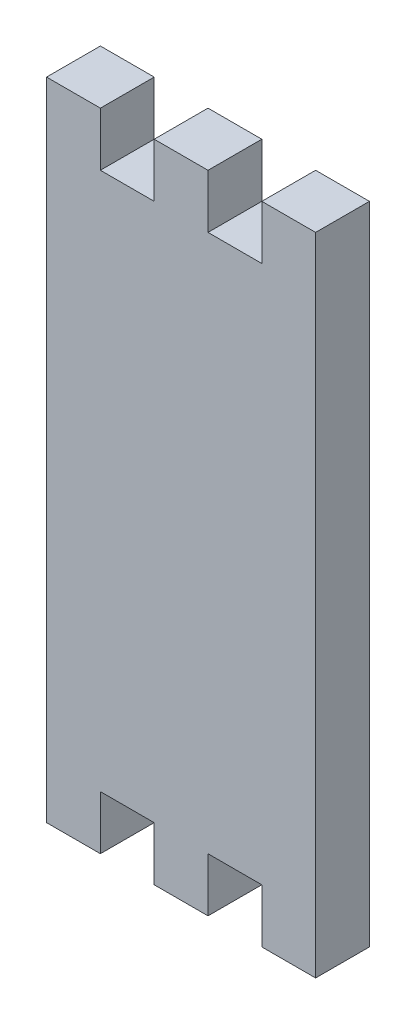
ISO-10303-21;
HEADER;
FILE_DESCRIPTION(('STEP AP214'),'2;1');
FILE_NAME('part.step','',(''),(''),'','','');
FILE_SCHEMA(('AUTOMOTIVE_DESIGN { 1 0 10303 214 1 1 1 1 }'));
ENDSEC;
DATA;
#1=APPLICATION_CONTEXT('core data for automotive mechanical design processes');
#2=APPLICATION_PROTOCOL_DEFINITION('international standard','automotive_design',2000,#1);
#3=PRODUCT_CONTEXT('',#1,'mechanical');
#4=PRODUCT('Part','Part','',(#3));
#5=PRODUCT_RELATED_PRODUCT_CATEGORY('part','',(#4));
#6=PRODUCT_DEFINITION_FORMATION('','',#4);
#7=PRODUCT_DEFINITION_CONTEXT('part definition',#1,'design');
#8=PRODUCT_DEFINITION('design','',#6,#7);
#9=PRODUCT_DEFINITION_SHAPE('','',#8);
#10=(LENGTH_UNIT() NAMED_UNIT(*) SI_UNIT(.MILLI.,.METRE.));
#11=(NAMED_UNIT(*) PLANE_ANGLE_UNIT() SI_UNIT($,.RADIAN.));
#12=(NAMED_UNIT(*) SI_UNIT($,.STERADIAN.) SOLID_ANGLE_UNIT());
#13=UNCERTAINTY_MEASURE_WITH_UNIT(LENGTH_MEASURE(1.E-05),#10,'distance_accuracy_value','');
#14=(GEOMETRIC_REPRESENTATION_CONTEXT(3) GLOBAL_UNCERTAINTY_ASSIGNED_CONTEXT((#13)) GLOBAL_UNIT_ASSIGNED_CONTEXT((#10,
#11,#12)) REPRESENTATION_CONTEXT('',''));
#15=CARTESIAN_POINT('',(0.,0.,0.));
#16=DIRECTION('',(0.,0.,1.));
#17=DIRECTION('',(1.,0.,0.));
#18=AXIS2_PLACEMENT_3D('',#15,#16,#17);
#19=CARTESIAN_POINT('',(2.41645885286782,18.0897755610973,3.));
#20=DIRECTION('',(1.,0.,0.));
#21=DIRECTION('',(0.,0.,-1.));
#22=AXIS2_PLACEMENT_3D('',#19,#20,#21);
#23=PLANE('',#22);
#24=DIRECTION('',(0.,-1.,0.));
#25=VECTOR('',#24,1.);
#26=CARTESIAN_POINT('',(2.41645885286782,18.0897755610973,0.));
#27=LINE('',#26,#25);
#28=CARTESIAN_POINT('',(2.41645885286782,18.0897755610973,0.));
#29=VERTEX_POINT('',#28);
#30=CARTESIAN_POINT('',(2.41645885286782,-17.9102244389027,0.));
#31=VERTEX_POINT('',#30);
#32=EDGE_CURVE('E212',#29,#31,#27,.T.);
#33=ORIENTED_EDGE('',*,*,#32,.T.);
#34=DIRECTION('',(0.,0.,-1.));
#35=VECTOR('',#34,1.);
#36=CARTESIAN_POINT('',(2.41645885286782,-17.9102244389027,3.));
#37=LINE('',#36,#35);
#38=CARTESIAN_POINT('',(2.41645885286782,-17.9102244389027,3.));
#39=VERTEX_POINT('',#38);
#40=EDGE_CURVE('E11',#39,#31,#37,.T.);
#41=ORIENTED_EDGE('',*,*,#40,.F.);
#42=DIRECTION('',(0.,-1.,0.));
#43=VECTOR('',#42,1.);
#44=CARTESIAN_POINT('',(2.41645885286782,18.0897755610973,3.));
#45=LINE('',#44,#43);
#46=CARTESIAN_POINT('',(2.41645885286782,18.0897755610973,3.));
#47=VERTEX_POINT('',#46);
#48=EDGE_CURVE('E270',#47,#39,#45,.T.);
#49=ORIENTED_EDGE('',*,*,#48,.F.);
#50=DIRECTION('',(0.,0.,-1.));
#51=VECTOR('',#50,1.);
#52=CARTESIAN_POINT('',(2.41645885286782,18.0897755610973,3.));
#53=LINE('',#52,#51);
#54=EDGE_CURVE('E208',#47,#29,#53,.T.);
#55=ORIENTED_EDGE('',*,*,#54,.T.);
#56=EDGE_LOOP('',(#33,#41,#49,#55));
#57=FACE_BOUND('',#56,.T.);
#58=ADVANCED_FACE('F39',(#57),#23,.F.);
#59=CARTESIAN_POINT('',(2.41645885286782,-17.9102244389027,3.));
#60=DIRECTION('',(0.,1.,0.));
#61=DIRECTION('',(0.,0.,1.));
#62=AXIS2_PLACEMENT_3D('',#59,#60,#61);
#63=PLANE('',#62);
#64=DIRECTION('',(1.,0.,0.));
#65=VECTOR('',#64,1.);
#66=CARTESIAN_POINT('',(2.41645885286782,-17.9102244389027,0.));
#67=LINE('',#66,#65);
#68=CARTESIAN_POINT('',(5.41645885286783,-17.9102244389027,0.));
#69=VERTEX_POINT('',#68);
#70=EDGE_CURVE('E216',#31,#69,#67,.T.);
#71=ORIENTED_EDGE('',*,*,#70,.T.);
#72=DIRECTION('',(0.,0.,-1.));
#73=VECTOR('',#72,1.);
#74=CARTESIAN_POINT('',(5.41645885286783,-17.9102244389027,3.));
#75=LINE('',#74,#73);
#76=CARTESIAN_POINT('',(5.41645885286783,-17.9102244389027,3.));
#77=VERTEX_POINT('',#76);
#78=EDGE_CURVE('E48',#77,#69,#75,.T.);
#79=ORIENTED_EDGE('',*,*,#78,.F.);
#80=DIRECTION('',(1.,0.,0.));
#81=VECTOR('',#80,1.);
#82=CARTESIAN_POINT('',(2.41645885286782,-17.9102244389027,3.));
#83=LINE('',#82,#81);
#84=EDGE_CURVE('E135',#39,#77,#83,.T.);
#85=ORIENTED_EDGE('',*,*,#84,.F.);
#86=ORIENTED_EDGE('',*,*,#40,.T.);
#87=EDGE_LOOP('',(#71,#79,#85,#86));
#88=FACE_BOUND('',#87,.T.);
#89=ADVANCED_FACE('F420',(#88),#63,.F.);
#90=CARTESIAN_POINT('',(5.41645885286783,-14.9102244389028,3.));
#91=DIRECTION('',(-1.,0.,0.));
#92=DIRECTION('',(0.,0.,1.));
#93=AXIS2_PLACEMENT_3D('',#90,#91,#92);
#94=PLANE('',#93);
#95=DIRECTION('',(0.,1.,0.));
#96=VECTOR('',#95,1.);
#97=CARTESIAN_POINT('',(5.41645885286783,-14.9102244389028,0.));
#98=LINE('',#97,#96);
#99=CARTESIAN_POINT('',(5.41645885286783,-14.9102244389028,0.));
#100=VERTEX_POINT('',#99);
#101=EDGE_CURVE('E219',#69,#100,#98,.T.);
#102=ORIENTED_EDGE('',*,*,#101,.T.);
#103=DIRECTION('',(0.,0.,-1.));
#104=VECTOR('',#103,1.);
#105=CARTESIAN_POINT('',(5.41645885286783,-14.9102244389028,3.));
#106=LINE('',#105,#104);
#107=CARTESIAN_POINT('',(5.41645885286783,-14.9102244389028,3.));
#108=VERTEX_POINT('',#107);
#109=EDGE_CURVE('E329',#108,#100,#106,.T.);
#110=ORIENTED_EDGE('',*,*,#109,.F.);
#111=DIRECTION('',(0.,1.,0.));
#112=VECTOR('',#111,1.);
#113=CARTESIAN_POINT('',(5.41645885286783,-14.9102244389028,3.));
#114=LINE('',#113,#112);
#115=EDGE_CURVE('E339',#77,#108,#114,.T.);
#116=ORIENTED_EDGE('',*,*,#115,.F.);
#117=ORIENTED_EDGE('',*,*,#78,.T.);
#118=EDGE_LOOP('',(#102,#110,#116,#117));
#119=FACE_BOUND('',#118,.T.);
#120=ADVANCED_FACE('F337',(#119),#94,.F.);
#121=CARTESIAN_POINT('',(5.41645885286783,-14.9102244389028,3.));
#122=DIRECTION('',(0.,1.,0.));
#123=DIRECTION('',(0.,0.,1.));
#124=AXIS2_PLACEMENT_3D('',#121,#122,#123);
#125=PLANE('',#124);
#126=DIRECTION('',(1.,0.,0.));
#127=VECTOR('',#126,1.);
#128=CARTESIAN_POINT('',(5.41645885286783,-14.9102244389028,0.));
#129=LINE('',#128,#127);
#130=CARTESIAN_POINT('',(8.41645885286783,-14.9102244389028,0.));
#131=VERTEX_POINT('',#130);
#132=EDGE_CURVE('E222',#100,#131,#129,.T.);
#133=ORIENTED_EDGE('',*,*,#132,.T.);
#134=DIRECTION('',(0.,0.,-1.));
#135=VECTOR('',#134,1.);
#136=CARTESIAN_POINT('',(8.41645885286783,-14.9102244389028,3.));
#137=LINE('',#136,#135);
#138=CARTESIAN_POINT('',(8.41645885286783,-14.9102244389028,3.));
#139=VERTEX_POINT('',#138);
#140=EDGE_CURVE('E325',#139,#131,#137,.T.);
#141=ORIENTED_EDGE('',*,*,#140,.F.);
#142=DIRECTION('',(1.,0.,0.));
#143=VECTOR('',#142,1.);
#144=CARTESIAN_POINT('',(5.41645885286783,-14.9102244389028,3.));
#145=LINE('',#144,#143);
#146=EDGE_CURVE('E358',#108,#139,#145,.T.);
#147=ORIENTED_EDGE('',*,*,#146,.F.);
#148=ORIENTED_EDGE('',*,*,#109,.T.);
#149=EDGE_LOOP('',(#133,#141,#147,#148));
#150=FACE_BOUND('',#149,.T.);
#151=ADVANCED_FACE('F348',(#150),#125,.F.);
#152=CARTESIAN_POINT('',(8.41645885286783,-14.9102244389028,3.));
#153=DIRECTION('',(1.,0.,0.));
#154=DIRECTION('',(0.,0.,-1.));
#155=AXIS2_PLACEMENT_3D('',#152,#153,#154);
#156=PLANE('',#155);
#157=DIRECTION('',(0.,-1.,0.));
#158=VECTOR('',#157,1.);
#159=CARTESIAN_POINT('',(8.41645885286783,-14.9102244389028,0.));
#160=LINE('',#159,#158);
#161=CARTESIAN_POINT('',(8.41645885286783,-17.9102244389027,0.));
#162=VERTEX_POINT('',#161);
#163=EDGE_CURVE('E225',#131,#162,#160,.T.);
#164=ORIENTED_EDGE('',*,*,#163,.T.);
#165=DIRECTION('',(0.,0.,-1.));
#166=VECTOR('',#165,1.);
#167=CARTESIAN_POINT('',(8.41645885286783,-17.9102244389027,3.));
#168=LINE('',#167,#166);
#169=CARTESIAN_POINT('',(8.41645885286783,-17.9102244389027,3.));
#170=VERTEX_POINT('',#169);
#171=EDGE_CURVE('E321',#170,#162,#168,.T.);
#172=ORIENTED_EDGE('',*,*,#171,.F.);
#173=DIRECTION('',(0.,-1.,0.));
#174=VECTOR('',#173,1.);
#175=CARTESIAN_POINT('',(8.41645885286783,-14.9102244389028,3.));
#176=LINE('',#175,#174);
#177=EDGE_CURVE('E354',#139,#170,#176,.T.);
#178=ORIENTED_EDGE('',*,*,#177,.F.);
#179=ORIENTED_EDGE('',*,*,#140,.T.);
#180=EDGE_LOOP('',(#164,#172,#178,#179));
#181=FACE_BOUND('',#180,.T.);
#182=ADVANCED_FACE('F352',(#181),#156,.F.);
#183=CARTESIAN_POINT('',(8.41645885286783,-17.9102244389027,3.));
#184=DIRECTION('',(0.,1.,0.));
#185=DIRECTION('',(0.,0.,1.));
#186=AXIS2_PLACEMENT_3D('',#183,#184,#185);
#187=PLANE('',#186);
#188=DIRECTION('',(1.,0.,0.));
#189=VECTOR('',#188,1.);
#190=CARTESIAN_POINT('',(8.41645885286783,-17.9102244389027,0.));
#191=LINE('',#190,#189);
#192=CARTESIAN_POINT('',(11.4164588528678,-17.9102244389027,0.));
#193=VERTEX_POINT('',#192);
#194=EDGE_CURVE('E228',#162,#193,#191,.T.);
#195=ORIENTED_EDGE('',*,*,#194,.T.);
#196=DIRECTION('',(0.,0.,-1.));
#197=VECTOR('',#196,1.);
#198=CARTESIAN_POINT('',(11.4164588528678,-17.9102244389027,3.));
#199=LINE('',#198,#197);
#200=CARTESIAN_POINT('',(11.4164588528678,-17.9102244389027,3.));
#201=VERTEX_POINT('',#200);
#202=EDGE_CURVE('E317',#201,#193,#199,.T.);
#203=ORIENTED_EDGE('',*,*,#202,.F.);
#204=DIRECTION('',(1.,0.,0.));
#205=VECTOR('',#204,1.);
#206=CARTESIAN_POINT('',(8.41645885286783,-17.9102244389027,3.));
#207=LINE('',#206,#205);
#208=EDGE_CURVE('E357',#170,#201,#207,.T.);
#209=ORIENTED_EDGE('',*,*,#208,.F.);
#210=ORIENTED_EDGE('',*,*,#171,.T.);
#211=EDGE_LOOP('',(#195,#203,#209,#210));
#212=FACE_BOUND('',#211,.T.);
#213=ADVANCED_FACE('F433',(#212),#187,.F.);
#214=CARTESIAN_POINT('',(11.4164588528678,-14.9102244389028,3.));
#215=DIRECTION('',(-1.,0.,0.));
#216=DIRECTION('',(0.,0.,1.));
#217=AXIS2_PLACEMENT_3D('',#214,#215,#216);
#218=PLANE('',#217);
#219=DIRECTION('',(0.,1.,0.));
#220=VECTOR('',#219,1.);
#221=CARTESIAN_POINT('',(11.4164588528678,-14.9102244389028,0.));
#222=LINE('',#221,#220);
#223=CARTESIAN_POINT('',(11.4164588528678,-14.9102244389028,0.));
#224=VERTEX_POINT('',#223);
#225=EDGE_CURVE('E231',#193,#224,#222,.T.);
#226=ORIENTED_EDGE('',*,*,#225,.T.);
#227=DIRECTION('',(0.,0.,-1.));
#228=VECTOR('',#227,1.);
#229=CARTESIAN_POINT('',(11.4164588528678,-14.9102244389028,3.));
#230=LINE('',#229,#228);
#231=CARTESIAN_POINT('',(11.4164588528678,-14.9102244389028,3.));
#232=VERTEX_POINT('',#231);
#233=EDGE_CURVE('E313',#232,#224,#230,.T.);
#234=ORIENTED_EDGE('',*,*,#233,.F.);
#235=DIRECTION('',(0.,1.,0.));
#236=VECTOR('',#235,1.);
#237=CARTESIAN_POINT('',(11.4164588528678,-14.9102244389028,3.));
#238=LINE('',#237,#236);
#239=EDGE_CURVE('E362',#201,#232,#238,.T.);
#240=ORIENTED_EDGE('',*,*,#239,.F.);
#241=ORIENTED_EDGE('',*,*,#202,.T.);
#242=EDGE_LOOP('',(#226,#234,#240,#241));
#243=FACE_BOUND('',#242,.T.);
#244=ADVANCED_FACE('F436',(#243),#218,.F.);
#245=CARTESIAN_POINT('',(14.4164588528678,-14.9102244389028,3.));
#246=DIRECTION('',(0.,1.,0.));
#247=DIRECTION('',(0.,0.,1.));
#248=AXIS2_PLACEMENT_3D('',#245,#246,#247);
#249=PLANE('',#248);
#250=DIRECTION('',(1.,0.,0.));
#251=VECTOR('',#250,1.);
#252=CARTESIAN_POINT('',(14.4164588528678,-14.9102244389028,0.));
#253=LINE('',#252,#251);
#254=CARTESIAN_POINT('',(14.4164588528678,-14.9102244389028,0.));
#255=VERTEX_POINT('',#254);
#256=EDGE_CURVE('E234',#224,#255,#253,.T.);
#257=ORIENTED_EDGE('',*,*,#256,.T.);
#258=DIRECTION('',(0.,0.,-1.));
#259=VECTOR('',#258,1.);
#260=CARTESIAN_POINT('',(14.4164588528678,-14.9102244389028,3.));
#261=LINE('',#260,#259);
#262=CARTESIAN_POINT('',(14.4164588528678,-14.9102244389028,3.));
#263=VERTEX_POINT('',#262);
#264=EDGE_CURVE('E309',#263,#255,#261,.T.);
#265=ORIENTED_EDGE('',*,*,#264,.F.);
#266=DIRECTION('',(1.,0.,0.));
#267=VECTOR('',#266,1.);
#268=CARTESIAN_POINT('',(14.4164588528678,-14.9102244389028,3.));
#269=LINE('',#268,#267);
#270=EDGE_CURVE('E369',#232,#263,#269,.T.);
#271=ORIENTED_EDGE('',*,*,#270,.F.);
#272=ORIENTED_EDGE('',*,*,#233,.T.);
#273=EDGE_LOOP('',(#257,#265,#271,#272));
#274=FACE_BOUND('',#273,.T.);
#275=ADVANCED_FACE('F440',(#274),#249,.F.);
#276=CARTESIAN_POINT('',(14.4164588528678,-14.9102244389028,3.));
#277=DIRECTION('',(1.,0.,0.));
#278=DIRECTION('',(0.,0.,-1.));
#279=AXIS2_PLACEMENT_3D('',#276,#277,#278);
#280=PLANE('',#279);
#281=DIRECTION('',(0.,-1.,0.));
#282=VECTOR('',#281,1.);
#283=CARTESIAN_POINT('',(14.4164588528678,-14.9102244389028,0.));
#284=LINE('',#283,#282);
#285=CARTESIAN_POINT('',(14.4164588528678,-17.9102244389027,0.));
#286=VERTEX_POINT('',#285);
#287=EDGE_CURVE('E237',#255,#286,#284,.T.);
#288=ORIENTED_EDGE('',*,*,#287,.T.);
#289=DIRECTION('',(0.,0.,-1.));
#290=VECTOR('',#289,1.);
#291=CARTESIAN_POINT('',(14.4164588528678,-17.9102244389027,3.));
#292=LINE('',#291,#290);
#293=CARTESIAN_POINT('',(14.4164588528678,-17.9102244389027,3.));
#294=VERTEX_POINT('',#293);
#295=EDGE_CURVE('E305',#294,#286,#292,.T.);
#296=ORIENTED_EDGE('',*,*,#295,.F.);
#297=DIRECTION('',(0.,-1.,0.));
#298=VECTOR('',#297,1.);
#299=CARTESIAN_POINT('',(14.4164588528678,-14.9102244389028,3.));
#300=LINE('',#299,#298);
#301=EDGE_CURVE('E372',#263,#294,#300,.T.);
#302=ORIENTED_EDGE('',*,*,#301,.F.);
#303=ORIENTED_EDGE('',*,*,#264,.T.);
#304=EDGE_LOOP('',(#288,#296,#302,#303));
#305=FACE_BOUND('',#304,.T.);
#306=ADVANCED_FACE('F444',(#305),#280,.F.);
#307=CARTESIAN_POINT('',(14.4164588528678,-17.9102244389027,3.));
#308=DIRECTION('',(0.,1.,0.));
#309=DIRECTION('',(-1.,0.,0.));
#310=AXIS2_PLACEMENT_3D('',#307,#308,#309);
#311=PLANE('',#310);
#312=DIRECTION('',(1.,0.,0.));
#313=VECTOR('',#312,1.);
#314=CARTESIAN_POINT('',(14.4164588528678,-17.9102244389027,0.));
#315=LINE('',#314,#313);
#316=CARTESIAN_POINT('',(17.4164588528678,-17.9102244389027,0.));
#317=VERTEX_POINT('',#316);
#318=EDGE_CURVE('E240',#286,#317,#315,.T.);
#319=ORIENTED_EDGE('',*,*,#318,.T.);
#320=DIRECTION('',(0.,0.,-1.));
#321=VECTOR('',#320,1.);
#322=CARTESIAN_POINT('',(17.4164588528678,-17.9102244389027,3.));
#323=LINE('',#322,#321);
#324=CARTESIAN_POINT('',(17.4164588528678,-17.9102244389027,3.));
#325=VERTEX_POINT('',#324);
#326=EDGE_CURVE('E301',#325,#317,#323,.T.);
#327=ORIENTED_EDGE('',*,*,#326,.F.);
#328=DIRECTION('',(1.,0.,0.));
#329=VECTOR('',#328,1.);
#330=CARTESIAN_POINT('',(14.4164588528678,-17.9102244389027,3.));
#331=LINE('',#330,#329);
#332=EDGE_CURVE('E375',#294,#325,#331,.T.);
#333=ORIENTED_EDGE('',*,*,#332,.F.);
#334=ORIENTED_EDGE('',*,*,#295,.T.);
#335=EDGE_LOOP('',(#319,#327,#333,#334));
#336=FACE_BOUND('',#335,.T.);
#337=ADVANCED_FACE('F448',(#336),#311,.F.);
#338=CARTESIAN_POINT('',(17.4164588528678,18.0897755610973,3.));
#339=DIRECTION('',(-1.,0.,0.));
#340=DIRECTION('',(0.,0.,1.));
#341=AXIS2_PLACEMENT_3D('',#338,#339,#340);
#342=PLANE('',#341);
#343=DIRECTION('',(0.,1.,0.));
#344=VECTOR('',#343,1.);
#345=CARTESIAN_POINT('',(17.4164588528678,18.0897755610973,0.));
#346=LINE('',#345,#344);
#347=CARTESIAN_POINT('',(17.4164588528678,18.0897755610973,0.));
#348=VERTEX_POINT('',#347);
#349=EDGE_CURVE('E243',#317,#348,#346,.T.);
#350=ORIENTED_EDGE('',*,*,#349,.T.);
#351=DIRECTION('',(0.,0.,-1.));
#352=VECTOR('',#351,1.);
#353=CARTESIAN_POINT('',(17.4164588528678,18.0897755610973,3.));
#354=LINE('',#353,#352);
#355=CARTESIAN_POINT('',(17.4164588528678,18.0897755610973,3.));
#356=VERTEX_POINT('',#355);
#357=EDGE_CURVE('E297',#356,#348,#354,.T.);
#358=ORIENTED_EDGE('',*,*,#357,.F.);
#359=DIRECTION('',(0.,1.,0.));
#360=VECTOR('',#359,1.);
#361=CARTESIAN_POINT('',(17.4164588528678,18.0897755610973,3.));
#362=LINE('',#361,#360);
#363=EDGE_CURVE('E378',#325,#356,#362,.T.);
#364=ORIENTED_EDGE('',*,*,#363,.F.);
#365=ORIENTED_EDGE('',*,*,#326,.T.);
#366=EDGE_LOOP('',(#350,#358,#364,#365));
#367=FACE_BOUND('',#366,.T.);
#368=ADVANCED_FACE('F452',(#367),#342,.F.);
#369=CARTESIAN_POINT('',(14.4164588528678,18.0897755610973,3.));
#370=DIRECTION('',(0.,-1.,0.));
#371=DIRECTION('',(0.,0.,-1.));
#372=AXIS2_PLACEMENT_3D('',#369,#370,#371);
#373=PLANE('',#372);
#374=DIRECTION('',(-1.,0.,0.));
#375=VECTOR('',#374,1.);
#376=CARTESIAN_POINT('',(14.4164588528678,18.0897755610973,0.));
#377=LINE('',#376,#375);
#378=CARTESIAN_POINT('',(14.4164588528678,18.0897755610973,0.));
#379=VERTEX_POINT('',#378);
#380=EDGE_CURVE('E246',#348,#379,#377,.T.);
#381=ORIENTED_EDGE('',*,*,#380,.T.);
#382=DIRECTION('',(0.,0.,-1.));
#383=VECTOR('',#382,1.);
#384=CARTESIAN_POINT('',(14.4164588528678,18.0897755610973,3.));
#385=LINE('',#384,#383);
#386=CARTESIAN_POINT('',(14.4164588528678,18.0897755610973,3.));
#387=VERTEX_POINT('',#386);
#388=EDGE_CURVE('E293',#387,#379,#385,.T.);
#389=ORIENTED_EDGE('',*,*,#388,.F.);
#390=DIRECTION('',(-1.,0.,0.));
#391=VECTOR('',#390,1.);
#392=CARTESIAN_POINT('',(14.4164588528678,18.0897755610973,3.));
#393=LINE('',#392,#391);
#394=EDGE_CURVE('E381',#356,#387,#393,.T.);
#395=ORIENTED_EDGE('',*,*,#394,.F.);
#396=ORIENTED_EDGE('',*,*,#357,.T.);
#397=EDGE_LOOP('',(#381,#389,#395,#396));
#398=FACE_BOUND('',#397,.T.);
#399=ADVANCED_FACE('F456',(#398),#373,.F.);
#400=CARTESIAN_POINT('',(14.4164588528678,15.0897755610973,3.));
#401=DIRECTION('',(1.,0.,0.));
#402=DIRECTION('',(0.,0.,-1.));
#403=AXIS2_PLACEMENT_3D('',#400,#401,#402);
#404=PLANE('',#403);
#405=DIRECTION('',(0.,-1.,0.));
#406=VECTOR('',#405,1.);
#407=CARTESIAN_POINT('',(14.4164588528678,15.0897755610973,0.));
#408=LINE('',#407,#406);
#409=CARTESIAN_POINT('',(14.4164588528678,15.0897755610973,0.));
#410=VERTEX_POINT('',#409);
#411=EDGE_CURVE('E249',#379,#410,#408,.T.);
#412=ORIENTED_EDGE('',*,*,#411,.T.);
#413=DIRECTION('',(0.,0.,-1.));
#414=VECTOR('',#413,1.);
#415=CARTESIAN_POINT('',(14.4164588528678,15.0897755610973,3.));
#416=LINE('',#415,#414);
#417=CARTESIAN_POINT('',(14.4164588528678,15.0897755610973,3.));
#418=VERTEX_POINT('',#417);
#419=EDGE_CURVE('E289',#418,#410,#416,.T.);
#420=ORIENTED_EDGE('',*,*,#419,.F.);
#421=DIRECTION('',(0.,-1.,0.));
#422=VECTOR('',#421,1.);
#423=CARTESIAN_POINT('',(14.4164588528678,15.0897755610973,3.));
#424=LINE('',#423,#422);
#425=EDGE_CURVE('E384',#387,#418,#424,.T.);
#426=ORIENTED_EDGE('',*,*,#425,.F.);
#427=ORIENTED_EDGE('',*,*,#388,.T.);
#428=EDGE_LOOP('',(#412,#420,#426,#427));
#429=FACE_BOUND('',#428,.T.);
#430=ADVANCED_FACE('F460',(#429),#404,.F.);
#431=CARTESIAN_POINT('',(14.4164588528678,15.0897755610973,3.));
#432=DIRECTION('',(0.,-1.,0.));
#433=DIRECTION('',(0.,0.,-1.));
#434=AXIS2_PLACEMENT_3D('',#431,#432,#433);
#435=PLANE('',#434);
#436=DIRECTION('',(-1.,0.,0.));
#437=VECTOR('',#436,1.);
#438=CARTESIAN_POINT('',(14.4164588528678,15.0897755610973,0.));
#439=LINE('',#438,#437);
#440=CARTESIAN_POINT('',(11.4164588528678,15.0897755610973,0.));
#441=VERTEX_POINT('',#440);
#442=EDGE_CURVE('E252',#410,#441,#439,.T.);
#443=ORIENTED_EDGE('',*,*,#442,.T.);
#444=DIRECTION('',(0.,0.,-1.));
#445=VECTOR('',#444,1.);
#446=CARTESIAN_POINT('',(11.4164588528678,15.0897755610973,3.));
#447=LINE('',#446,#445);
#448=CARTESIAN_POINT('',(11.4164588528678,15.0897755610973,3.));
#449=VERTEX_POINT('',#448);
#450=EDGE_CURVE('E285',#449,#441,#447,.T.);
#451=ORIENTED_EDGE('',*,*,#450,.F.);
#452=DIRECTION('',(-1.,0.,0.));
#453=VECTOR('',#452,1.);
#454=CARTESIAN_POINT('',(14.4164588528678,15.0897755610973,3.));
#455=LINE('',#454,#453);
#456=EDGE_CURVE('E387',#418,#449,#455,.T.);
#457=ORIENTED_EDGE('',*,*,#456,.F.);
#458=ORIENTED_EDGE('',*,*,#419,.T.);
#459=EDGE_LOOP('',(#443,#451,#457,#458));
#460=FACE_BOUND('',#459,.T.);
#461=ADVANCED_FACE('F464',(#460),#435,.F.);
#462=CARTESIAN_POINT('',(11.4164588528678,15.0897755610973,3.));
#463=DIRECTION('',(-1.,0.,0.));
#464=DIRECTION('',(0.,0.,1.));
#465=AXIS2_PLACEMENT_3D('',#462,#463,#464);
#466=PLANE('',#465);
#467=DIRECTION('',(0.,1.,0.));
#468=VECTOR('',#467,1.);
#469=CARTESIAN_POINT('',(11.4164588528678,15.0897755610973,0.));
#470=LINE('',#469,#468);
#471=CARTESIAN_POINT('',(11.4164588528678,18.0897755610973,0.));
#472=VERTEX_POINT('',#471);
#473=EDGE_CURVE('E255',#441,#472,#470,.T.);
#474=ORIENTED_EDGE('',*,*,#473,.T.);
#475=DIRECTION('',(0.,0.,-1.));
#476=VECTOR('',#475,1.);
#477=CARTESIAN_POINT('',(11.4164588528678,18.0897755610973,3.));
#478=LINE('',#477,#476);
#479=CARTESIAN_POINT('',(11.4164588528678,18.0897755610973,3.));
#480=VERTEX_POINT('',#479);
#481=EDGE_CURVE('E281',#480,#472,#478,.T.);
#482=ORIENTED_EDGE('',*,*,#481,.F.);
#483=DIRECTION('',(0.,1.,0.));
#484=VECTOR('',#483,1.);
#485=CARTESIAN_POINT('',(11.4164588528678,15.0897755610973,3.));
#486=LINE('',#485,#484);
#487=EDGE_CURVE('E390',#449,#480,#486,.T.);
#488=ORIENTED_EDGE('',*,*,#487,.F.);
#489=ORIENTED_EDGE('',*,*,#450,.T.);
#490=EDGE_LOOP('',(#474,#482,#488,#489));
#491=FACE_BOUND('',#490,.T.);
#492=ADVANCED_FACE('F468',(#491),#466,.F.);
#493=CARTESIAN_POINT('',(8.41645885286783,18.0897755610973,3.));
#494=DIRECTION('',(0.,-1.,0.));
#495=DIRECTION('',(0.,0.,-1.));
#496=AXIS2_PLACEMENT_3D('',#493,#494,#495);
#497=PLANE('',#496);
#498=DIRECTION('',(-1.,0.,0.));
#499=VECTOR('',#498,1.);
#500=CARTESIAN_POINT('',(8.41645885286783,18.0897755610973,0.));
#501=LINE('',#500,#499);
#502=CARTESIAN_POINT('',(8.41645885286783,18.0897755610973,0.));
#503=VERTEX_POINT('',#502);
#504=EDGE_CURVE('E258',#472,#503,#501,.T.);
#505=ORIENTED_EDGE('',*,*,#504,.T.);
#506=DIRECTION('',(0.,0.,-1.));
#507=VECTOR('',#506,1.);
#508=CARTESIAN_POINT('',(8.41645885286783,18.0897755610973,3.));
#509=LINE('',#508,#507);
#510=CARTESIAN_POINT('',(8.41645885286783,18.0897755610973,3.));
#511=VERTEX_POINT('',#510);
#512=EDGE_CURVE('E277',#511,#503,#509,.T.);
#513=ORIENTED_EDGE('',*,*,#512,.F.);
#514=DIRECTION('',(-1.,0.,0.));
#515=VECTOR('',#514,1.);
#516=CARTESIAN_POINT('',(8.41645885286783,18.0897755610973,3.));
#517=LINE('',#516,#515);
#518=EDGE_CURVE('E393',#480,#511,#517,.T.);
#519=ORIENTED_EDGE('',*,*,#518,.F.);
#520=ORIENTED_EDGE('',*,*,#481,.T.);
#521=EDGE_LOOP('',(#505,#513,#519,#520));
#522=FACE_BOUND('',#521,.T.);
#523=ADVANCED_FACE('F401',(#522),#497,.F.);
#524=CARTESIAN_POINT('',(8.41645885286783,15.0897755610973,3.));
#525=DIRECTION('',(1.,0.,0.));
#526=DIRECTION('',(0.,0.,-1.));
#527=AXIS2_PLACEMENT_3D('',#524,#525,#526);
#528=PLANE('',#527);
#529=DIRECTION('',(0.,-1.,0.));
#530=VECTOR('',#529,1.);
#531=CARTESIAN_POINT('',(8.41645885286783,15.0897755610973,0.));
#532=LINE('',#531,#530);
#533=CARTESIAN_POINT('',(8.41645885286783,15.0897755610973,0.));
#534=VERTEX_POINT('',#533);
#535=EDGE_CURVE('E261',#503,#534,#532,.T.);
#536=ORIENTED_EDGE('',*,*,#535,.T.);
#537=DIRECTION('',(0.,0.,-1.));
#538=VECTOR('',#537,1.);
#539=CARTESIAN_POINT('',(8.41645885286783,15.0897755610973,3.));
#540=LINE('',#539,#538);
#541=CARTESIAN_POINT('',(8.41645885286783,15.0897755610973,3.));
#542=VERTEX_POINT('',#541);
#543=EDGE_CURVE('E201',#542,#534,#540,.T.);
#544=ORIENTED_EDGE('',*,*,#543,.F.);
#545=DIRECTION('',(0.,-1.,0.));
#546=VECTOR('',#545,1.);
#547=CARTESIAN_POINT('',(8.41645885286783,15.0897755610973,3.));
#548=LINE('',#547,#546);
#549=EDGE_CURVE('E190',#511,#542,#548,.T.);
#550=ORIENTED_EDGE('',*,*,#549,.F.);
#551=ORIENTED_EDGE('',*,*,#512,.T.);
#552=EDGE_LOOP('',(#536,#544,#550,#551));
#553=FACE_BOUND('',#552,.T.);
#554=ADVANCED_FACE('F405',(#553),#528,.F.);
#555=CARTESIAN_POINT('',(5.41645885286783,15.0897755610973,3.));
#556=DIRECTION('',(0.,-1.,0.));
#557=DIRECTION('',(0.,0.,-1.));
#558=AXIS2_PLACEMENT_3D('',#555,#556,#557);
#559=PLANE('',#558);
#560=DIRECTION('',(-1.,0.,0.));
#561=VECTOR('',#560,1.);
#562=CARTESIAN_POINT('',(5.41645885286783,15.0897755610973,0.));
#563=LINE('',#562,#561);
#564=CARTESIAN_POINT('',(5.41645885286783,15.0897755610973,0.));
#565=VERTEX_POINT('',#564);
#566=EDGE_CURVE('E199',#534,#565,#563,.T.);
#567=ORIENTED_EDGE('',*,*,#566,.T.);
#568=DIRECTION('',(0.,0.,-1.));
#569=VECTOR('',#568,1.);
#570=CARTESIAN_POINT('',(5.41645885286783,15.0897755610973,3.));
#571=LINE('',#570,#569);
#572=CARTESIAN_POINT('',(5.41645885286783,15.0897755610973,3.));
#573=VERTEX_POINT('',#572);
#574=EDGE_CURVE('E196',#573,#565,#571,.T.);
#575=ORIENTED_EDGE('',*,*,#574,.F.);
#576=DIRECTION('',(-1.,0.,0.));
#577=VECTOR('',#576,1.);
#578=CARTESIAN_POINT('',(5.41645885286783,15.0897755610973,3.));
#579=LINE('',#578,#577);
#580=EDGE_CURVE('E184',#542,#573,#579,.T.);
#581=ORIENTED_EDGE('',*,*,#580,.F.);
#582=ORIENTED_EDGE('',*,*,#543,.T.);
#583=EDGE_LOOP('',(#567,#575,#581,#582));
#584=FACE_BOUND('',#583,.T.);
#585=ADVANCED_FACE('F197',(#584),#559,.F.);
#586=CARTESIAN_POINT('',(5.41645885286783,15.0897755610973,3.));
#587=DIRECTION('',(-1.,0.,0.));
#588=DIRECTION('',(0.,0.,1.));
#589=AXIS2_PLACEMENT_3D('',#586,#587,#588);
#590=PLANE('',#589);
#591=DIRECTION('',(0.,1.,0.));
#592=VECTOR('',#591,1.);
#593=CARTESIAN_POINT('',(5.41645885286783,15.0897755610973,0.));
#594=LINE('',#593,#592);
#595=CARTESIAN_POINT('',(5.41645885286783,18.0897755610973,0.));
#596=VERTEX_POINT('',#595);
#597=EDGE_CURVE('E121',#565,#596,#594,.T.);
#598=ORIENTED_EDGE('',*,*,#597,.T.);
#599=DIRECTION('',(0.,0.,-1.));
#600=VECTOR('',#599,1.);
#601=CARTESIAN_POINT('',(5.41645885286783,18.0897755610973,3.));
#602=LINE('',#601,#600);
#603=CARTESIAN_POINT('',(5.41645885286783,18.0897755610973,3.));
#604=VERTEX_POINT('',#603);
#605=EDGE_CURVE('E202',#604,#596,#602,.T.);
#606=ORIENTED_EDGE('',*,*,#605,.F.);
#607=DIRECTION('',(0.,1.,0.));
#608=VECTOR('',#607,1.);
#609=CARTESIAN_POINT('',(5.41645885286783,15.0897755610973,3.));
#610=LINE('',#609,#608);
#611=EDGE_CURVE('E188',#573,#604,#610,.T.);
#612=ORIENTED_EDGE('',*,*,#611,.F.);
#613=ORIENTED_EDGE('',*,*,#574,.T.);
#614=EDGE_LOOP('',(#598,#606,#612,#613));
#615=FACE_BOUND('',#614,.T.);
#616=ADVANCED_FACE('F204',(#615),#590,.F.);
#617=CARTESIAN_POINT('',(2.41645885286782,18.0897755610973,3.));
#618=DIRECTION('',(0.,-1.,0.));
#619=DIRECTION('',(0.,0.,-1.));
#620=AXIS2_PLACEMENT_3D('',#617,#618,#619);
#621=PLANE('',#620);
#622=DIRECTION('',(-1.,0.,0.));
#623=VECTOR('',#622,1.);
#624=CARTESIAN_POINT('',(2.41645885286782,18.0897755610973,0.));
#625=LINE('',#624,#623);
#626=EDGE_CURVE('E127',#596,#29,#625,.T.);
#627=ORIENTED_EDGE('',*,*,#626,.T.);
#628=ORIENTED_EDGE('',*,*,#54,.F.);
#629=DIRECTION('',(-1.,0.,0.));
#630=VECTOR('',#629,1.);
#631=CARTESIAN_POINT('',(2.41645885286782,18.0897755610973,3.));
#632=LINE('',#631,#630);
#633=EDGE_CURVE('E56',#604,#47,#632,.T.);
#634=ORIENTED_EDGE('',*,*,#633,.F.);
#635=ORIENTED_EDGE('',*,*,#605,.T.);
#636=EDGE_LOOP('',(#627,#628,#634,#635));
#637=FACE_BOUND('',#636,.T.);
#638=ADVANCED_FACE('F409',(#637),#621,.F.);
#639=CARTESIAN_POINT('',(0.,0.,3.));
#640=DIRECTION('',(0.,0.,1.));
#641=DIRECTION('',(1.,0.,0.));
#642=AXIS2_PLACEMENT_3D('',#639,#640,#641);
#643=PLANE('',#642);
#644=ORIENTED_EDGE('',*,*,#48,.T.);
#645=ORIENTED_EDGE('',*,*,#84,.T.);
#646=ORIENTED_EDGE('',*,*,#115,.T.);
#647=ORIENTED_EDGE('',*,*,#146,.T.);
#648=ORIENTED_EDGE('',*,*,#177,.T.);
#649=ORIENTED_EDGE('',*,*,#208,.T.);
#650=ORIENTED_EDGE('',*,*,#239,.T.);
#651=ORIENTED_EDGE('',*,*,#270,.T.);
#652=ORIENTED_EDGE('',*,*,#301,.T.);
#653=ORIENTED_EDGE('',*,*,#332,.T.);
#654=ORIENTED_EDGE('',*,*,#363,.T.);
#655=ORIENTED_EDGE('',*,*,#394,.T.);
#656=ORIENTED_EDGE('',*,*,#425,.T.);
#657=ORIENTED_EDGE('',*,*,#456,.T.);
#658=ORIENTED_EDGE('',*,*,#487,.T.);
#659=ORIENTED_EDGE('',*,*,#518,.T.);
#660=ORIENTED_EDGE('',*,*,#549,.T.);
#661=ORIENTED_EDGE('',*,*,#580,.T.);
#662=ORIENTED_EDGE('',*,*,#611,.T.);
#663=ORIENTED_EDGE('',*,*,#633,.T.);
#664=EDGE_LOOP('',(#644,#645,#646,#647,#648,#649,#650,#651,#652,#653,#654,#655,#656,#657,#658,
#659,#660,#661,#662,#663));
#665=FACE_BOUND('',#664,.T.);
#666=ADVANCED_FACE('F186',(#665),#643,.T.);
#667=CARTESIAN_POINT('',(0.,0.,0.));
#668=DIRECTION('',(0.,0.,1.));
#669=DIRECTION('',(1.,0.,0.));
#670=AXIS2_PLACEMENT_3D('',#667,#668,#669);
#671=PLANE('',#670);
#672=ORIENTED_EDGE('',*,*,#32,.F.);
#673=ORIENTED_EDGE('',*,*,#626,.F.);
#674=ORIENTED_EDGE('',*,*,#597,.F.);
#675=ORIENTED_EDGE('',*,*,#566,.F.);
#676=ORIENTED_EDGE('',*,*,#535,.F.);
#677=ORIENTED_EDGE('',*,*,#504,.F.);
#678=ORIENTED_EDGE('',*,*,#473,.F.);
#679=ORIENTED_EDGE('',*,*,#442,.F.);
#680=ORIENTED_EDGE('',*,*,#411,.F.);
#681=ORIENTED_EDGE('',*,*,#380,.F.);
#682=ORIENTED_EDGE('',*,*,#349,.F.);
#683=ORIENTED_EDGE('',*,*,#318,.F.);
#684=ORIENTED_EDGE('',*,*,#287,.F.);
#685=ORIENTED_EDGE('',*,*,#256,.F.);
#686=ORIENTED_EDGE('',*,*,#225,.F.);
#687=ORIENTED_EDGE('',*,*,#194,.F.);
#688=ORIENTED_EDGE('',*,*,#163,.F.);
#689=ORIENTED_EDGE('',*,*,#132,.F.);
#690=ORIENTED_EDGE('',*,*,#101,.F.);
#691=ORIENTED_EDGE('',*,*,#70,.F.);
#692=EDGE_LOOP('',(#672,#673,#674,#675,#676,#677,#678,#679,#680,#681,#682,#683,#684,#685,#686,
#687,#688,#689,#690,#691));
#693=FACE_BOUND('',#692,.T.);
#694=ADVANCED_FACE('F343',(#693),#671,.F.);
#695=CLOSED_SHELL('',(#58,#89,#120,#151,#182,#213,#244,#275,#306,#337,#368,#399,#430,#461,#492,
#523,#554,#585,#616,#638,#666,#694));
#696=MANIFOLD_SOLID_BREP('B2',#695);
#697=ADVANCED_BREP_SHAPE_REPRESENTATION('',(#18,#696),#14);
#698=SHAPE_DEFINITION_REPRESENTATION(#9,#697);
ENDSEC;
END-ISO-10303-21;
